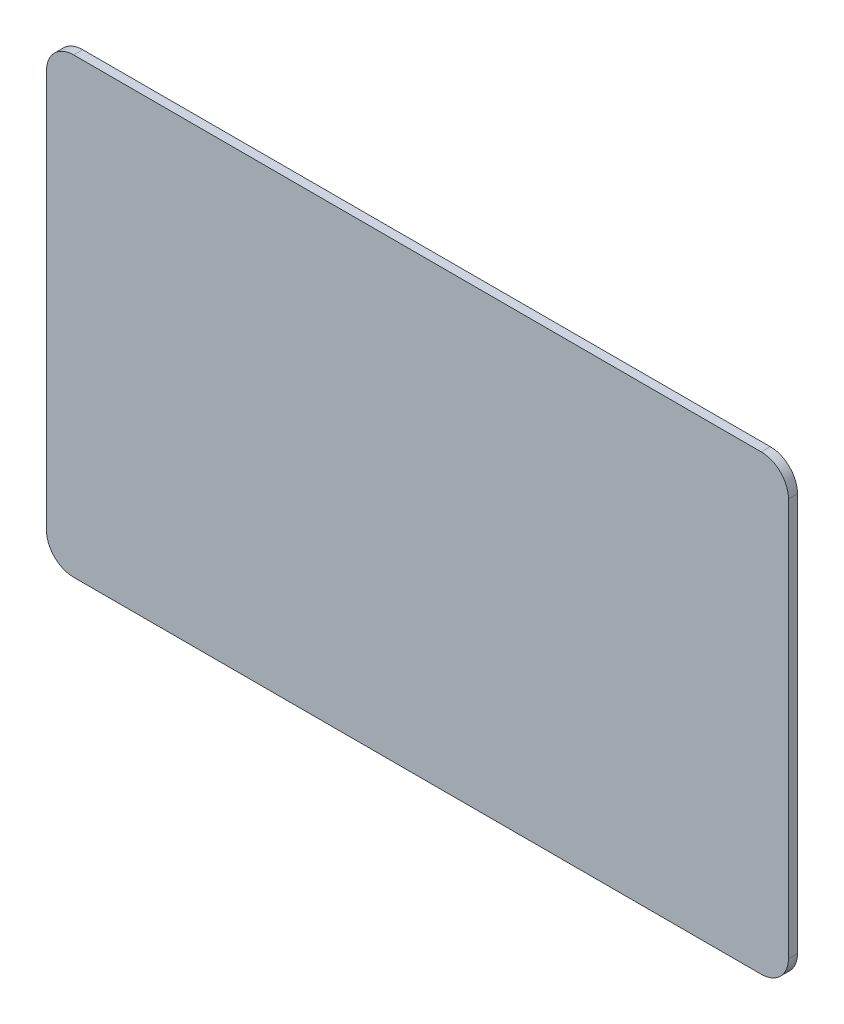
ISO-10303-21;
HEADER;
FILE_DESCRIPTION(('STEP AP214'),'2;1');
FILE_NAME('part.step','',(''),(''),'','','');
FILE_SCHEMA(('AUTOMOTIVE_DESIGN { 1 0 10303 214 1 1 1 1 }'));
ENDSEC;
DATA;
#1=APPLICATION_CONTEXT('core data for automotive mechanical design processes');
#2=APPLICATION_PROTOCOL_DEFINITION('international standard','automotive_design',2000,#1);
#3=PRODUCT_CONTEXT('',#1,'mechanical');
#4=PRODUCT('Part','Part','',(#3));
#5=PRODUCT_RELATED_PRODUCT_CATEGORY('part','',(#4));
#6=PRODUCT_DEFINITION_FORMATION('','',#4);
#7=PRODUCT_DEFINITION_CONTEXT('part definition',#1,'design');
#8=PRODUCT_DEFINITION('design','',#6,#7);
#9=PRODUCT_DEFINITION_SHAPE('','',#8);
#10=(LENGTH_UNIT() NAMED_UNIT(*) SI_UNIT(.MILLI.,.METRE.));
#11=(NAMED_UNIT(*) PLANE_ANGLE_UNIT() SI_UNIT($,.RADIAN.));
#12=(NAMED_UNIT(*) SI_UNIT($,.STERADIAN.) SOLID_ANGLE_UNIT());
#13=UNCERTAINTY_MEASURE_WITH_UNIT(LENGTH_MEASURE(1.E-05),#10,'distance_accuracy_value','');
#14=(GEOMETRIC_REPRESENTATION_CONTEXT(3) GLOBAL_UNCERTAINTY_ASSIGNED_CONTEXT((#13)) GLOBAL_UNIT_ASSIGNED_CONTEXT((#10,
#11,#12)) REPRESENTATION_CONTEXT('',''));
#15=CARTESIAN_POINT('',(0.,0.,0.));
#16=DIRECTION('',(0.,0.,1.));
#17=DIRECTION('',(1.,0.,0.));
#18=AXIS2_PLACEMENT_3D('',#15,#16,#17);
#19=CARTESIAN_POINT('',(41.,25.,1.));
#20=DIRECTION('',(-1.,0.,0.));
#21=DIRECTION('',(0.,-1.,0.));
#22=AXIS2_PLACEMENT_3D('',#19,#20,#21);
#23=PLANE('',#22);
#24=DIRECTION('',(0.,1.,0.));
#25=VECTOR('',#24,1.);
#26=CARTESIAN_POINT('',(41.,25.,1.));
#27=LINE('',#26,#25);
#28=CARTESIAN_POINT('',(41.,-22.,1.));
#29=VERTEX_POINT('',#28);
#30=CARTESIAN_POINT('',(41.,22.,1.));
#31=VERTEX_POINT('',#30);
#32=EDGE_CURVE('E124',#29,#31,#27,.T.);
#33=ORIENTED_EDGE('',*,*,#32,.F.);
#34=DIRECTION('',(0.,0.,-1.));
#35=VECTOR('',#34,1.);
#36=CARTESIAN_POINT('',(41.,-22.,1.));
#37=LINE('',#36,#35);
#38=CARTESIAN_POINT('',(41.,-22.,0.));
#39=VERTEX_POINT('',#38);
#40=EDGE_CURVE('E109',#29,#39,#37,.T.);
#41=ORIENTED_EDGE('',*,*,#40,.T.);
#42=DIRECTION('',(0.,1.,0.));
#43=VECTOR('',#42,1.);
#44=CARTESIAN_POINT('',(41.,25.,0.));
#45=LINE('',#44,#43);
#46=CARTESIAN_POINT('',(41.,22.,0.));
#47=VERTEX_POINT('',#46);
#48=EDGE_CURVE('E121',#39,#47,#45,.T.);
#49=ORIENTED_EDGE('',*,*,#48,.T.);
#50=DIRECTION('',(0.,0.,-1.));
#51=VECTOR('',#50,1.);
#52=CARTESIAN_POINT('',(41.,22.,1.));
#53=LINE('',#52,#51);
#54=EDGE_CURVE('E126',#47,#31,#53,.F.);
#55=ORIENTED_EDGE('',*,*,#54,.T.);
#56=EDGE_LOOP('',(#33,#41,#49,#55));
#57=FACE_BOUND('',#56,.T.);
#58=ADVANCED_FACE('F40',(#57),#23,.F.);
#59=CARTESIAN_POINT('',(-41.,25.,1.));
#60=DIRECTION('',(0.,-1.,0.));
#61=DIRECTION('',(0.,0.,-1.));
#62=AXIS2_PLACEMENT_3D('',#59,#60,#61);
#63=PLANE('',#62);
#64=DIRECTION('',(-1.,0.,0.));
#65=VECTOR('',#64,1.);
#66=CARTESIAN_POINT('',(-41.,25.,1.));
#67=LINE('',#66,#65);
#68=CARTESIAN_POINT('',(38.,25.,1.));
#69=VERTEX_POINT('',#68);
#70=CARTESIAN_POINT('',(-38.,25.,1.));
#71=VERTEX_POINT('',#70);
#72=EDGE_CURVE('E175',#69,#71,#67,.T.);
#73=ORIENTED_EDGE('',*,*,#72,.F.);
#74=DIRECTION('',(0.,0.,-1.));
#75=VECTOR('',#74,1.);
#76=CARTESIAN_POINT('',(38.,25.,1.));
#77=LINE('',#76,#75);
#78=CARTESIAN_POINT('',(38.,25.,0.));
#79=VERTEX_POINT('',#78);
#80=EDGE_CURVE('E159',#69,#79,#77,.T.);
#81=ORIENTED_EDGE('',*,*,#80,.T.);
#82=DIRECTION('',(-1.,0.,0.));
#83=VECTOR('',#82,1.);
#84=CARTESIAN_POINT('',(-41.,25.,0.));
#85=LINE('',#84,#83);
#86=CARTESIAN_POINT('',(-38.,25.,0.));
#87=VERTEX_POINT('',#86);
#88=EDGE_CURVE('E130',#79,#87,#85,.T.);
#89=ORIENTED_EDGE('',*,*,#88,.T.);
#90=DIRECTION('',(0.,0.,-1.));
#91=VECTOR('',#90,1.);
#92=CARTESIAN_POINT('',(-38.,25.,1.));
#93=LINE('',#92,#91);
#94=EDGE_CURVE('E157',#87,#71,#93,.F.);
#95=ORIENTED_EDGE('',*,*,#94,.T.);
#96=EDGE_LOOP('',(#73,#81,#89,#95));
#97=FACE_BOUND('',#96,.T.);
#98=ADVANCED_FACE('F185',(#97),#63,.F.);
#99=CARTESIAN_POINT('',(-41.,25.,1.));
#100=DIRECTION('',(1.,0.,0.));
#101=DIRECTION('',(0.,1.,0.));
#102=AXIS2_PLACEMENT_3D('',#99,#100,#101);
#103=PLANE('',#102);
#104=DIRECTION('',(0.,-1.,0.));
#105=VECTOR('',#104,1.);
#106=CARTESIAN_POINT('',(-41.,25.,0.));
#107=LINE('',#106,#105);
#108=CARTESIAN_POINT('',(-41.,22.,0.));
#109=VERTEX_POINT('',#108);
#110=CARTESIAN_POINT('',(-41.,-22.,0.));
#111=VERTEX_POINT('',#110);
#112=EDGE_CURVE('E133',#109,#111,#107,.T.);
#113=ORIENTED_EDGE('',*,*,#112,.T.);
#114=DIRECTION('',(0.,0.,-1.));
#115=VECTOR('',#114,1.);
#116=CARTESIAN_POINT('',(-41.,-22.,1.));
#117=LINE('',#116,#115);
#118=CARTESIAN_POINT('',(-41.,-22.,1.));
#119=VERTEX_POINT('',#118);
#120=EDGE_CURVE('E11',#111,#119,#117,.F.);
#121=ORIENTED_EDGE('',*,*,#120,.T.);
#122=DIRECTION('',(0.,-1.,0.));
#123=VECTOR('',#122,1.);
#124=CARTESIAN_POINT('',(-41.,25.,1.));
#125=LINE('',#124,#123);
#126=CARTESIAN_POINT('',(-41.,22.,1.));
#127=VERTEX_POINT('',#126);
#128=EDGE_CURVE('E165',#127,#119,#125,.T.);
#129=ORIENTED_EDGE('',*,*,#128,.F.);
#130=DIRECTION('',(0.,0.,-1.));
#131=VECTOR('',#130,1.);
#132=CARTESIAN_POINT('',(-41.,22.,1.));
#133=LINE('',#132,#131);
#134=EDGE_CURVE('E48',#127,#109,#133,.T.);
#135=ORIENTED_EDGE('',*,*,#134,.T.);
#136=EDGE_LOOP('',(#113,#121,#129,#135));
#137=FACE_BOUND('',#136,.T.);
#138=ADVANCED_FACE('F164',(#137),#103,.F.);
#139=CARTESIAN_POINT('',(-41.,-25.,1.));
#140=DIRECTION('',(0.,1.,0.));
#141=DIRECTION('',(0.,0.,1.));
#142=AXIS2_PLACEMENT_3D('',#139,#140,#141);
#143=PLANE('',#142);
#144=DIRECTION('',(1.,0.,0.));
#145=VECTOR('',#144,1.);
#146=CARTESIAN_POINT('',(-41.,-25.,0.));
#147=LINE('',#146,#145);
#148=CARTESIAN_POINT('',(-38.,-25.,0.));
#149=VERTEX_POINT('',#148);
#150=CARTESIAN_POINT('',(38.,-25.,0.));
#151=VERTEX_POINT('',#150);
#152=EDGE_CURVE('E140',#149,#151,#147,.T.);
#153=ORIENTED_EDGE('',*,*,#152,.T.);
#154=DIRECTION('',(0.,0.,-1.));
#155=VECTOR('',#154,1.);
#156=CARTESIAN_POINT('',(38.,-25.,1.));
#157=LINE('',#156,#155);
#158=CARTESIAN_POINT('',(38.,-25.,1.));
#159=VERTEX_POINT('',#158);
#160=EDGE_CURVE('E110',#151,#159,#157,.F.);
#161=ORIENTED_EDGE('',*,*,#160,.T.);
#162=DIRECTION('',(1.,0.,0.));
#163=VECTOR('',#162,1.);
#164=CARTESIAN_POINT('',(-41.,-25.,1.));
#165=LINE('',#164,#163);
#166=CARTESIAN_POINT('',(-38.,-25.,1.));
#167=VERTEX_POINT('',#166);
#168=EDGE_CURVE('E136',#167,#159,#165,.T.);
#169=ORIENTED_EDGE('',*,*,#168,.F.);
#170=DIRECTION('',(0.,0.,-1.));
#171=VECTOR('',#170,1.);
#172=CARTESIAN_POINT('',(-38.,-25.,1.));
#173=LINE('',#172,#171);
#174=EDGE_CURVE('E115',#167,#149,#173,.T.);
#175=ORIENTED_EDGE('',*,*,#174,.T.);
#176=EDGE_LOOP('',(#153,#161,#169,#175));
#177=FACE_BOUND('',#176,.T.);
#178=ADVANCED_FACE('F173',(#177),#143,.F.);
#179=CARTESIAN_POINT('',(0.,0.,1.));
#180=DIRECTION('',(0.,0.,1.));
#181=DIRECTION('',(1.,0.,0.));
#182=AXIS2_PLACEMENT_3D('',#179,#180,#181);
#183=PLANE('',#182);
#184=ORIENTED_EDGE('',*,*,#168,.T.);
#185=CARTESIAN_POINT('',(38.,-22.,1.));
#186=DIRECTION('',(0.,0.,1.));
#187=DIRECTION('',(1.,0.,0.));
#188=AXIS2_PLACEMENT_3D('',#185,#186,#187);
#189=CIRCLE('',#188,3.);
#190=EDGE_CURVE('E155',#159,#29,#189,.T.);
#191=ORIENTED_EDGE('',*,*,#190,.T.);
#192=ORIENTED_EDGE('',*,*,#32,.T.);
#193=CARTESIAN_POINT('',(38.,22.,1.));
#194=DIRECTION('',(0.,0.,1.));
#195=DIRECTION('',(1.,0.,0.));
#196=AXIS2_PLACEMENT_3D('',#193,#194,#195);
#197=CIRCLE('',#196,3.);
#198=EDGE_CURVE('E153',#31,#69,#197,.T.);
#199=ORIENTED_EDGE('',*,*,#198,.T.);
#200=ORIENTED_EDGE('',*,*,#72,.T.);
#201=CARTESIAN_POINT('',(-38.,22.,1.));
#202=DIRECTION('',(0.,0.,1.));
#203=DIRECTION('',(1.,0.,0.));
#204=AXIS2_PLACEMENT_3D('',#201,#202,#203);
#205=CIRCLE('',#204,3.);
#206=EDGE_CURVE('E60',#71,#127,#205,.T.);
#207=ORIENTED_EDGE('',*,*,#206,.T.);
#208=ORIENTED_EDGE('',*,*,#128,.T.);
#209=CARTESIAN_POINT('',(-38.,-22.,1.));
#210=DIRECTION('',(0.,0.,1.));
#211=DIRECTION('',(1.,0.,0.));
#212=AXIS2_PLACEMENT_3D('',#209,#210,#211);
#213=CIRCLE('',#212,3.);
#214=EDGE_CURVE('E151',#119,#167,#213,.T.);
#215=ORIENTED_EDGE('',*,*,#214,.T.);
#216=EDGE_LOOP('',(#184,#191,#192,#199,#200,#207,#208,#215));
#217=FACE_BOUND('',#216,.T.);
#218=ADVANCED_FACE('F179',(#217),#183,.T.);
#219=CARTESIAN_POINT('',(0.,0.,0.));
#220=DIRECTION('',(0.,0.,1.));
#221=DIRECTION('',(1.,0.,0.));
#222=AXIS2_PLACEMENT_3D('',#219,#220,#221);
#223=PLANE('',#222);
#224=ORIENTED_EDGE('',*,*,#48,.F.);
#225=CARTESIAN_POINT('',(38.,-22.,0.));
#226=DIRECTION('',(0.,0.,1.));
#227=DIRECTION('',(1.,0.,0.));
#228=AXIS2_PLACEMENT_3D('',#225,#226,#227);
#229=CIRCLE('',#228,3.);
#230=EDGE_CURVE('E105',#39,#151,#229,.F.);
#231=ORIENTED_EDGE('',*,*,#230,.T.);
#232=ORIENTED_EDGE('',*,*,#152,.F.);
#233=CARTESIAN_POINT('',(-38.,-22.,0.));
#234=DIRECTION('',(0.,0.,1.));
#235=DIRECTION('',(1.,0.,0.));
#236=AXIS2_PLACEMENT_3D('',#233,#234,#235);
#237=CIRCLE('',#236,3.);
#238=EDGE_CURVE('E144',#149,#111,#237,.F.);
#239=ORIENTED_EDGE('',*,*,#238,.T.);
#240=ORIENTED_EDGE('',*,*,#112,.F.);
#241=CARTESIAN_POINT('',(-38.,22.,0.));
#242=DIRECTION('',(0.,0.,1.));
#243=DIRECTION('',(1.,0.,0.));
#244=AXIS2_PLACEMENT_3D('',#241,#242,#243);
#245=CIRCLE('',#244,3.);
#246=EDGE_CURVE('E125',#109,#87,#245,.F.);
#247=ORIENTED_EDGE('',*,*,#246,.T.);
#248=ORIENTED_EDGE('',*,*,#88,.F.);
#249=CARTESIAN_POINT('',(38.,22.,0.));
#250=DIRECTION('',(0.,0.,1.));
#251=DIRECTION('',(1.,0.,0.));
#252=AXIS2_PLACEMENT_3D('',#249,#250,#251);
#253=CIRCLE('',#252,3.);
#254=EDGE_CURVE('E116',#79,#47,#253,.F.);
#255=ORIENTED_EDGE('',*,*,#254,.T.);
#256=EDGE_LOOP('',(#224,#231,#232,#239,#240,#247,#248,#255));
#257=FACE_BOUND('',#256,.T.);
#258=ADVANCED_FACE('F128',(#257),#223,.F.);
#259=CARTESIAN_POINT('',(38.,-22.,1.));
#260=DIRECTION('',(0.,0.,-1.));
#261=DIRECTION('',(-1.,0.,0.));
#262=AXIS2_PLACEMENT_3D('',#259,#260,#261);
#263=CYLINDRICAL_SURFACE('',#262,3.);
#264=ORIENTED_EDGE('',*,*,#190,.F.);
#265=ORIENTED_EDGE('',*,*,#160,.F.);
#266=ORIENTED_EDGE('',*,*,#230,.F.);
#267=ORIENTED_EDGE('',*,*,#40,.F.);
#268=EDGE_LOOP('',(#264,#265,#266,#267));
#269=FACE_BOUND('',#268,.T.);
#270=ADVANCED_FACE('F108',(#269),#263,.T.);
#271=CARTESIAN_POINT('',(38.,22.,1.));
#272=DIRECTION('',(0.,0.,-1.));
#273=DIRECTION('',(-1.,0.,0.));
#274=AXIS2_PLACEMENT_3D('',#271,#272,#273);
#275=CYLINDRICAL_SURFACE('',#274,3.);
#276=ORIENTED_EDGE('',*,*,#198,.F.);
#277=ORIENTED_EDGE('',*,*,#54,.F.);
#278=ORIENTED_EDGE('',*,*,#254,.F.);
#279=ORIENTED_EDGE('',*,*,#80,.F.);
#280=EDGE_LOOP('',(#276,#277,#278,#279));
#281=FACE_BOUND('',#280,.T.);
#282=ADVANCED_FACE('F183',(#281),#275,.T.);
#283=CARTESIAN_POINT('',(-38.,-22.,1.));
#284=DIRECTION('',(0.,0.,-1.));
#285=DIRECTION('',(-1.,0.,0.));
#286=AXIS2_PLACEMENT_3D('',#283,#284,#285);
#287=CYLINDRICAL_SURFACE('',#286,3.);
#288=ORIENTED_EDGE('',*,*,#214,.F.);
#289=ORIENTED_EDGE('',*,*,#120,.F.);
#290=ORIENTED_EDGE('',*,*,#238,.F.);
#291=ORIENTED_EDGE('',*,*,#174,.F.);
#292=EDGE_LOOP('',(#288,#289,#290,#291));
#293=FACE_BOUND('',#292,.T.);
#294=ADVANCED_FACE('F170',(#293),#287,.T.);
#295=CARTESIAN_POINT('',(-38.,22.,1.));
#296=DIRECTION('',(0.,0.,-1.));
#297=DIRECTION('',(-1.,0.,0.));
#298=AXIS2_PLACEMENT_3D('',#295,#296,#297);
#299=CYLINDRICAL_SURFACE('',#298,3.);
#300=ORIENTED_EDGE('',*,*,#206,.F.);
#301=ORIENTED_EDGE('',*,*,#94,.F.);
#302=ORIENTED_EDGE('',*,*,#246,.F.);
#303=ORIENTED_EDGE('',*,*,#134,.F.);
#304=EDGE_LOOP('',(#300,#301,#302,#303));
#305=FACE_BOUND('',#304,.T.);
#306=ADVANCED_FACE('F42',(#305),#299,.T.);
#307=CLOSED_SHELL('',(#58,#98,#138,#178,#218,#258,#270,#282,#294,#306));
#308=MANIFOLD_SOLID_BREP('B2',#307);
#309=ADVANCED_BREP_SHAPE_REPRESENTATION('',(#18,#308),#14);
#310=SHAPE_DEFINITION_REPRESENTATION(#9,#309);
ENDSEC;
END-ISO-10303-21;
